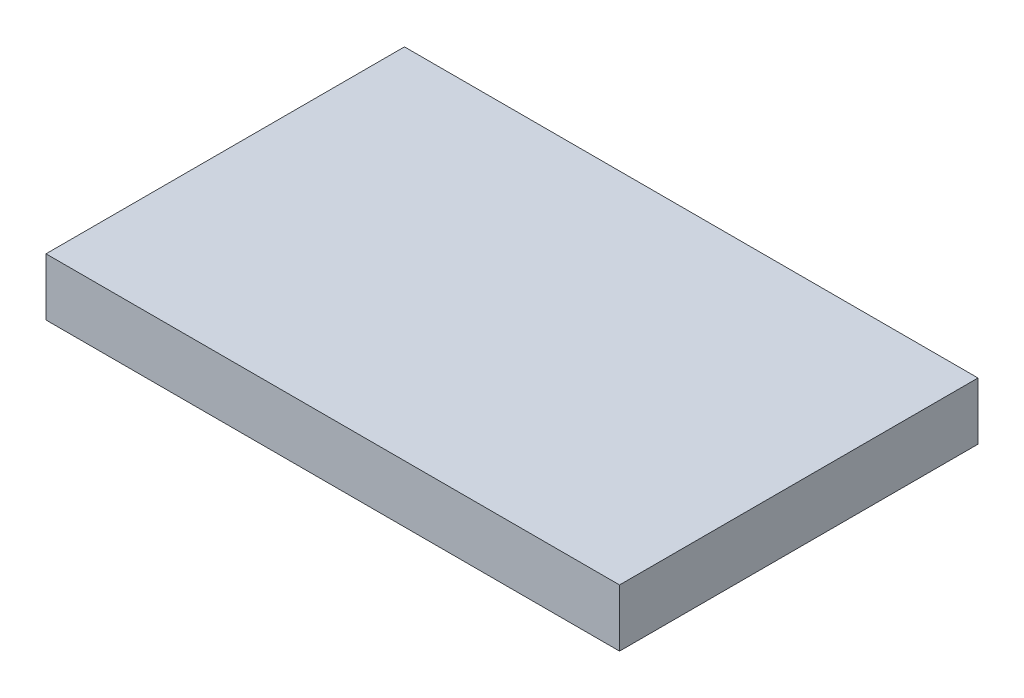
ISO-10303-21;
HEADER;
FILE_DESCRIPTION(('STEP AP214'),'2;1');
FILE_NAME('part.step','',(''),(''),'','','');
FILE_SCHEMA(('AUTOMOTIVE_DESIGN { 1 0 10303 214 1 1 1 1 }'));
ENDSEC;
DATA;
#1=APPLICATION_CONTEXT('core data for automotive mechanical design processes');
#2=APPLICATION_PROTOCOL_DEFINITION('international standard','automotive_design',2000,#1);
#3=PRODUCT_CONTEXT('',#1,'mechanical');
#4=PRODUCT('Part','Part','',(#3));
#5=PRODUCT_RELATED_PRODUCT_CATEGORY('part','',(#4));
#6=PRODUCT_DEFINITION_FORMATION('','',#4);
#7=PRODUCT_DEFINITION_CONTEXT('part definition',#1,'design');
#8=PRODUCT_DEFINITION('design','',#6,#7);
#9=PRODUCT_DEFINITION_SHAPE('','',#8);
#10=(LENGTH_UNIT() NAMED_UNIT(*) SI_UNIT(.MILLI.,.METRE.));
#11=(NAMED_UNIT(*) PLANE_ANGLE_UNIT() SI_UNIT($,.RADIAN.));
#12=(NAMED_UNIT(*) SI_UNIT($,.STERADIAN.) SOLID_ANGLE_UNIT());
#13=UNCERTAINTY_MEASURE_WITH_UNIT(LENGTH_MEASURE(1.E-05),#10,'distance_accuracy_value','');
#14=(GEOMETRIC_REPRESENTATION_CONTEXT(3) GLOBAL_UNCERTAINTY_ASSIGNED_CONTEXT((#13)) GLOBAL_UNIT_ASSIGNED_CONTEXT((#10,
#11,#12)) REPRESENTATION_CONTEXT('',''));
#15=CARTESIAN_POINT('',(0.,0.,0.));
#16=DIRECTION('',(0.,0.,1.));
#17=DIRECTION('',(1.,0.,0.));
#18=AXIS2_PLACEMENT_3D('',#15,#16,#17);
#19=CARTESIAN_POINT('',(0.,7.62,0.));
#20=DIRECTION('',(0.,-1.,0.));
#21=DIRECTION('',(0.,0.,-1.));
#22=AXIS2_PLACEMENT_3D('',#19,#20,#21);
#23=CONICAL_SURFACE('',#22,3.80999999999998,0.380506377112362);
#24=CARTESIAN_POINT('',(0.,6.35,0.));
#25=DIRECTION('',(0.,1.,0.));
#26=DIRECTION('',(0.,0.,1.));
#27=AXIS2_PLACEMENT_3D('',#24,#25,#26);
#28=CIRCLE('',#27,4.31799999999998);
#29=CARTESIAN_POINT('',(0.,6.35,4.31799999999998));
#30=VERTEX_POINT('',#29);
#31=EDGE_CURVE('E110',#30,#30,#28,.F.);
#32=ORIENTED_EDGE('',*,*,#31,.F.);
#33=EDGE_LOOP('',(#32));
#34=FACE_BOUND('',#33,.T.);
#35=CARTESIAN_POINT('',(0.,3.81,0.));
#36=DIRECTION('',(0.,-1.,0.));
#37=DIRECTION('',(0.,0.,-1.));
#38=AXIS2_PLACEMENT_3D('',#35,#36,#37);
#39=CIRCLE('',#38,5.33399999999997);
#40=CARTESIAN_POINT('',(0.,3.81,-5.33399999999997));
#41=VERTEX_POINT('',#40);
#42=EDGE_CURVE('E45',#41,#41,#39,.F.);
#43=ORIENTED_EDGE('',*,*,#42,.F.);
#44=EDGE_LOOP('',(#43));
#45=FACE_BOUND('',#44,.T.);
#46=ADVANCED_FACE('F41',(#34,#45),#23,.F.);
#47=CARTESIAN_POINT('',(0.,6.35,0.));
#48=DIRECTION('',(0.,1.,0.));
#49=DIRECTION('',(0.,0.,1.));
#50=AXIS2_PLACEMENT_3D('',#47,#48,#49);
#51=CYLINDRICAL_SURFACE('',#50,5.08);
#52=CARTESIAN_POINT('',(0.,6.35,0.));
#53=DIRECTION('',(0.,1.,0.));
#54=DIRECTION('',(0.,0.,1.));
#55=AXIS2_PLACEMENT_3D('',#52,#53,#54);
#56=CIRCLE('',#55,5.08);
#57=CARTESIAN_POINT('',(0.,6.35,5.08));
#58=VERTEX_POINT('',#57);
#59=EDGE_CURVE('E114',#58,#58,#56,.T.);
#60=ORIENTED_EDGE('',*,*,#59,.F.);
#61=EDGE_LOOP('',(#60));
#62=FACE_BOUND('',#61,.T.);
#63=CARTESIAN_POINT('',(0.,7.62,0.));
#64=DIRECTION('',(0.,1.,0.));
#65=DIRECTION('',(0.,0.,1.));
#66=AXIS2_PLACEMENT_3D('',#63,#64,#65);
#67=CIRCLE('',#66,5.08);
#68=CARTESIAN_POINT('',(0.,7.62,5.08));
#69=VERTEX_POINT('',#68);
#70=EDGE_CURVE('E141',#69,#69,#67,.T.);
#71=ORIENTED_EDGE('',*,*,#70,.T.);
#72=EDGE_LOOP('',(#71));
#73=FACE_BOUND('',#72,.T.);
#74=ADVANCED_FACE('F151',(#62,#73),#51,.F.);
#75=CARTESIAN_POINT('',(0.,6.35,0.));
#76=DIRECTION('',(0.,1.,0.));
#77=DIRECTION('',(0.,0.,1.));
#78=AXIS2_PLACEMENT_3D('',#75,#76,#77);
#79=PLANE('',#78);
#80=ORIENTED_EDGE('',*,*,#31,.T.);
#81=EDGE_LOOP('',(#80));
#82=FACE_BOUND('',#81,.T.);
#83=ORIENTED_EDGE('',*,*,#59,.T.);
#84=EDGE_LOOP('',(#83));
#85=FACE_BOUND('',#84,.T.);
#86=ADVANCED_FACE('F159',(#82,#85),#79,.T.);
#87=CARTESIAN_POINT('',(0.,7.62,0.));
#88=DIRECTION('',(0.,1.,0.));
#89=DIRECTION('',(0.,0.,1.));
#90=AXIS2_PLACEMENT_3D('',#87,#88,#89);
#91=PLANE('',#90);
#92=ORIENTED_EDGE('',*,*,#70,.F.);
#93=EDGE_LOOP('',(#92));
#94=FACE_BOUND('',#93,.T.);
#95=ADVANCED_FACE('F165',(#94),#91,.F.);
#96=CARTESIAN_POINT('',(0.,3.81,0.));
#97=DIRECTION('',(0.,-1.,0.));
#98=DIRECTION('',(0.,0.,-1.));
#99=AXIS2_PLACEMENT_3D('',#96,#97,#98);
#100=PLANE('',#99);
#101=DIRECTION('',(0.,0.,1.));
#102=VECTOR('',#101,1.);
#103=CARTESIAN_POINT('',(25.4,3.81,-15.875));
#104=LINE('',#103,#102);
#105=CARTESIAN_POINT('',(25.4,3.81,-15.875));
#106=VERTEX_POINT('',#105);
#107=CARTESIAN_POINT('',(25.4,3.81,15.875));
#108=VERTEX_POINT('',#107);
#109=EDGE_CURVE('E83',#106,#108,#104,.T.);
#110=ORIENTED_EDGE('',*,*,#109,.T.);
#111=DIRECTION('',(-1.,0.,0.));
#112=VECTOR('',#111,1.);
#113=CARTESIAN_POINT('',(25.4,3.81,15.875));
#114=LINE('',#113,#112);
#115=CARTESIAN_POINT('',(-25.4,3.81,15.875));
#116=VERTEX_POINT('',#115);
#117=EDGE_CURVE('E58',#108,#116,#114,.T.);
#118=ORIENTED_EDGE('',*,*,#117,.T.);
#119=DIRECTION('',(0.,0.,-1.));
#120=VECTOR('',#119,1.);
#121=CARTESIAN_POINT('',(-25.4,3.81,15.875));
#122=LINE('',#121,#120);
#123=CARTESIAN_POINT('',(-25.4,3.81,-15.875));
#124=VERTEX_POINT('',#123);
#125=EDGE_CURVE('E99',#116,#124,#122,.T.);
#126=ORIENTED_EDGE('',*,*,#125,.T.);
#127=DIRECTION('',(1.,0.,0.));
#128=VECTOR('',#127,1.);
#129=CARTESIAN_POINT('',(-25.4,3.81,-15.875));
#130=LINE('',#129,#128);
#131=EDGE_CURVE('E87',#124,#106,#130,.T.);
#132=ORIENTED_EDGE('',*,*,#131,.T.);
#133=EDGE_LOOP('',(#110,#118,#126,#132));
#134=FACE_BOUND('',#133,.T.);
#135=ORIENTED_EDGE('',*,*,#42,.T.);
#136=EDGE_LOOP('',(#135));
#137=FACE_BOUND('',#136,.T.);
#138=ADVANCED_FACE('F84',(#134,#137),#100,.T.);
#139=CARTESIAN_POINT('',(0.,8.89,0.));
#140=DIRECTION('',(0.,1.,0.));
#141=DIRECTION('',(0.,0.,1.));
#142=AXIS2_PLACEMENT_3D('',#139,#140,#141);
#143=PLANE('',#142);
#144=DIRECTION('',(1.,0.,0.));
#145=VECTOR('',#144,1.);
#146=CARTESIAN_POINT('',(-25.4,8.89,15.875));
#147=LINE('',#146,#145);
#148=CARTESIAN_POINT('',(-25.4,8.89,15.875));
#149=VERTEX_POINT('',#148);
#150=CARTESIAN_POINT('',(25.4,8.89,15.875));
#151=VERTEX_POINT('',#150);
#152=EDGE_CURVE('E106',#149,#151,#147,.T.);
#153=ORIENTED_EDGE('',*,*,#152,.T.);
#154=DIRECTION('',(0.,0.,-1.));
#155=VECTOR('',#154,1.);
#156=CARTESIAN_POINT('',(25.4,8.89,15.875));
#157=LINE('',#156,#155);
#158=CARTESIAN_POINT('',(25.4,8.89,-15.875));
#159=VERTEX_POINT('',#158);
#160=EDGE_CURVE('E102',#151,#159,#157,.T.);
#161=ORIENTED_EDGE('',*,*,#160,.T.);
#162=DIRECTION('',(-1.,0.,0.));
#163=VECTOR('',#162,1.);
#164=CARTESIAN_POINT('',(25.4,8.89,-15.875));
#165=LINE('',#164,#163);
#166=CARTESIAN_POINT('',(-25.4,8.89,-15.875));
#167=VERTEX_POINT('',#166);
#168=EDGE_CURVE('E105',#159,#167,#165,.T.);
#169=ORIENTED_EDGE('',*,*,#168,.T.);
#170=DIRECTION('',(0.,0.,1.));
#171=VECTOR('',#170,1.);
#172=CARTESIAN_POINT('',(-25.4,8.89,-15.875));
#173=LINE('',#172,#171);
#174=EDGE_CURVE('E66',#167,#149,#173,.T.);
#175=ORIENTED_EDGE('',*,*,#174,.T.);
#176=EDGE_LOOP('',(#153,#161,#169,#175));
#177=FACE_BOUND('',#176,.T.);
#178=ADVANCED_FACE('F108',(#177),#143,.T.);
#179=CARTESIAN_POINT('',(-25.4,8.89,-15.875));
#180=DIRECTION('',(1.,0.,0.));
#181=DIRECTION('',(0.,0.,-1.));
#182=AXIS2_PLACEMENT_3D('',#179,#180,#181);
#183=PLANE('',#182);
#184=ORIENTED_EDGE('',*,*,#125,.F.);
#185=DIRECTION('',(0.,-1.,0.));
#186=VECTOR('',#185,1.);
#187=CARTESIAN_POINT('',(-25.4,8.89,15.875));
#188=LINE('',#187,#186);
#189=EDGE_CURVE('E97',#149,#116,#188,.T.);
#190=ORIENTED_EDGE('',*,*,#189,.F.);
#191=ORIENTED_EDGE('',*,*,#174,.F.);
#192=DIRECTION('',(0.,-1.,0.));
#193=VECTOR('',#192,1.);
#194=CARTESIAN_POINT('',(-25.4,8.89,-15.875));
#195=LINE('',#194,#193);
#196=EDGE_CURVE('E124',#167,#124,#195,.T.);
#197=ORIENTED_EDGE('',*,*,#196,.T.);
#198=EDGE_LOOP('',(#184,#190,#191,#197));
#199=FACE_BOUND('',#198,.T.);
#200=ADVANCED_FACE('F133',(#199),#183,.F.);
#201=CARTESIAN_POINT('',(25.4,8.89,-15.875));
#202=DIRECTION('',(0.,0.,1.));
#203=DIRECTION('',(1.,0.,0.));
#204=AXIS2_PLACEMENT_3D('',#201,#202,#203);
#205=PLANE('',#204);
#206=ORIENTED_EDGE('',*,*,#131,.F.);
#207=ORIENTED_EDGE('',*,*,#196,.F.);
#208=ORIENTED_EDGE('',*,*,#168,.F.);
#209=DIRECTION('',(0.,-1.,0.));
#210=VECTOR('',#209,1.);
#211=CARTESIAN_POINT('',(25.4,8.89,-15.875));
#212=LINE('',#211,#210);
#213=EDGE_CURVE('E51',#159,#106,#212,.T.);
#214=ORIENTED_EDGE('',*,*,#213,.T.);
#215=EDGE_LOOP('',(#206,#207,#208,#214));
#216=FACE_BOUND('',#215,.T.);
#217=ADVANCED_FACE('F130',(#216),#205,.F.);
#218=CARTESIAN_POINT('',(25.4,8.89,15.875));
#219=DIRECTION('',(-1.,0.,0.));
#220=DIRECTION('',(0.,0.,1.));
#221=AXIS2_PLACEMENT_3D('',#218,#219,#220);
#222=PLANE('',#221);
#223=ORIENTED_EDGE('',*,*,#109,.F.);
#224=ORIENTED_EDGE('',*,*,#213,.F.);
#225=ORIENTED_EDGE('',*,*,#160,.F.);
#226=DIRECTION('',(0.,-1.,0.));
#227=VECTOR('',#226,1.);
#228=CARTESIAN_POINT('',(25.4,8.89,15.875));
#229=LINE('',#228,#227);
#230=EDGE_CURVE('E11',#151,#108,#229,.T.);
#231=ORIENTED_EDGE('',*,*,#230,.T.);
#232=EDGE_LOOP('',(#223,#224,#225,#231));
#233=FACE_BOUND('',#232,.T.);
#234=ADVANCED_FACE('F101',(#233),#222,.F.);
#235=CARTESIAN_POINT('',(-25.4,8.89,15.875));
#236=DIRECTION('',(0.,0.,-1.));
#237=DIRECTION('',(-1.,0.,0.));
#238=AXIS2_PLACEMENT_3D('',#235,#236,#237);
#239=PLANE('',#238);
#240=ORIENTED_EDGE('',*,*,#117,.F.);
#241=ORIENTED_EDGE('',*,*,#230,.F.);
#242=ORIENTED_EDGE('',*,*,#152,.F.);
#243=ORIENTED_EDGE('',*,*,#189,.T.);
#244=EDGE_LOOP('',(#240,#241,#242,#243));
#245=FACE_BOUND('',#244,.T.);
#246=ADVANCED_FACE('F43',(#245),#239,.F.);
#247=CLOSED_SHELL('',(#46,#74,#86,#95,#138,#178,#200,#217,#234,#246));
#248=MANIFOLD_SOLID_BREP('B2',#247);
#249=ADVANCED_BREP_SHAPE_REPRESENTATION('',(#18,#248),#14);
#250=SHAPE_DEFINITION_REPRESENTATION(#9,#249);
ENDSEC;
END-ISO-10303-21;
